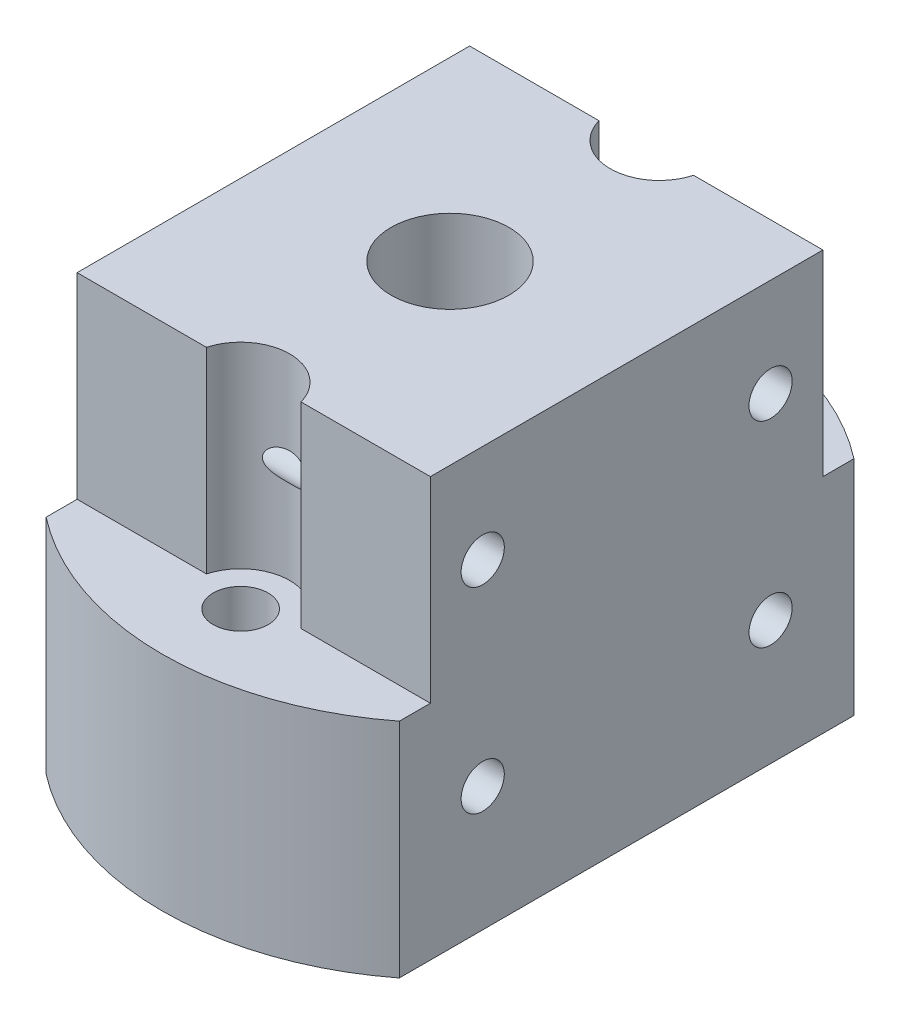
ISO-10303-21;
HEADER;
FILE_DESCRIPTION(('STEP AP214'),'2;1');
FILE_NAME('part.step','',(''),(''),'','','');
FILE_SCHEMA(('AUTOMOTIVE_DESIGN { 1 0 10303 214 1 1 1 1 }'));
ENDSEC;
DATA;
#1=APPLICATION_CONTEXT('core data for automotive mechanical design processes');
#2=APPLICATION_PROTOCOL_DEFINITION('international standard','automotive_design',2000,#1);
#3=PRODUCT_CONTEXT('',#1,'mechanical');
#4=PRODUCT('Part','Part','',(#3));
#5=PRODUCT_RELATED_PRODUCT_CATEGORY('part','',(#4));
#6=PRODUCT_DEFINITION_FORMATION('','',#4);
#7=PRODUCT_DEFINITION_CONTEXT('part definition',#1,'design');
#8=PRODUCT_DEFINITION('design','',#6,#7);
#9=PRODUCT_DEFINITION_SHAPE('','',#8);
#10=(LENGTH_UNIT() NAMED_UNIT(*) SI_UNIT(.MILLI.,.METRE.));
#11=(NAMED_UNIT(*) PLANE_ANGLE_UNIT() SI_UNIT($,.RADIAN.));
#12=(NAMED_UNIT(*) SI_UNIT($,.STERADIAN.) SOLID_ANGLE_UNIT());
#13=UNCERTAINTY_MEASURE_WITH_UNIT(LENGTH_MEASURE(1.E-05),#10,'distance_accuracy_value','');
#14=(GEOMETRIC_REPRESENTATION_CONTEXT(3) GLOBAL_UNCERTAINTY_ASSIGNED_CONTEXT((#13)) GLOBAL_UNIT_ASSIGNED_CONTEXT((#10,
#11,#12)) REPRESENTATION_CONTEXT('',''));
#15=CARTESIAN_POINT('',(0.,0.,0.));
#16=DIRECTION('',(0.,0.,1.));
#17=DIRECTION('',(1.,0.,0.));
#18=AXIS2_PLACEMENT_3D('',#15,#16,#17);
#19=CARTESIAN_POINT('',(-13.5,32.,15.));
#20=DIRECTION('',(0.,0.,-1.));
#21=DIRECTION('',(-1.,0.,0.));
#22=AXIS2_PLACEMENT_3D('',#19,#20,#21);
#23=PLANE('',#22);
#24=DIRECTION('',(1.,0.,0.));
#25=VECTOR('',#24,1.);
#26=CARTESIAN_POINT('',(-13.5,17.,15.));
#27=LINE('',#26,#25);
#28=CARTESIAN_POINT('',(-13.5,17.,15.));
#29=VERTEX_POINT('',#28);
#30=CARTESIAN_POINT('',(-3.61420807370023,17.,15.));
#31=VERTEX_POINT('',#30);
#32=EDGE_CURVE('E159',#29,#31,#27,.T.);
#33=ORIENTED_EDGE('',*,*,#32,.T.);
#34=DIRECTION('',(0.,1.,0.));
#35=VECTOR('',#34,1.);
#36=CARTESIAN_POINT('',(-3.61420807370023,6.39339828220178,15.));
#37=LINE('',#36,#35);
#38=CARTESIAN_POINT('',(-3.61420807370023,32.,15.));
#39=VERTEX_POINT('',#38);
#40=EDGE_CURVE('E11',#31,#39,#37,.T.);
#41=ORIENTED_EDGE('',*,*,#40,.T.);
#42=DIRECTION('',(1.,0.,0.));
#43=VECTOR('',#42,1.);
#44=CARTESIAN_POINT('',(-13.5,32.,15.));
#45=LINE('',#44,#43);
#46=CARTESIAN_POINT('',(-13.5,32.,15.));
#47=VERTEX_POINT('',#46);
#48=EDGE_CURVE('E177',#47,#39,#45,.T.);
#49=ORIENTED_EDGE('',*,*,#48,.F.);
#50=DIRECTION('',(0.,-1.,0.));
#51=VECTOR('',#50,1.);
#52=CARTESIAN_POINT('',(-13.5,32.,15.));
#53=LINE('',#52,#51);
#54=EDGE_CURVE('E176',#47,#29,#53,.T.);
#55=ORIENTED_EDGE('',*,*,#54,.T.);
#56=EDGE_LOOP('',(#33,#41,#49,#55));
#57=FACE_BOUND('',#56,.T.);
#58=ADVANCED_FACE('F41',(#57),#23,.F.);
#59=CARTESIAN_POINT('',(-13.5,32.,-15.));
#60=DIRECTION('',(0.,0.,1.));
#61=DIRECTION('',(1.,0.,0.));
#62=AXIS2_PLACEMENT_3D('',#59,#60,#61);
#63=PLANE('',#62);
#64=DIRECTION('',(-1.,0.,0.));
#65=VECTOR('',#64,1.);
#66=CARTESIAN_POINT('',(-13.5,17.,-15.));
#67=LINE('',#66,#65);
#68=CARTESIAN_POINT('',(13.5,17.,-15.));
#69=VERTEX_POINT('',#68);
#70=CARTESIAN_POINT('',(3.61420807370024,17.,-15.));
#71=VERTEX_POINT('',#70);
#72=EDGE_CURVE('E58',#69,#71,#67,.T.);
#73=ORIENTED_EDGE('',*,*,#72,.T.);
#74=DIRECTION('',(0.,1.,0.));
#75=VECTOR('',#74,1.);
#76=CARTESIAN_POINT('',(3.61420807370024,6.39339828220178,-15.));
#77=LINE('',#76,#75);
#78=CARTESIAN_POINT('',(3.61420807370024,32.,-15.));
#79=VERTEX_POINT('',#78);
#80=EDGE_CURVE('E139',#71,#79,#77,.T.);
#81=ORIENTED_EDGE('',*,*,#80,.T.);
#82=DIRECTION('',(-1.,0.,0.));
#83=VECTOR('',#82,1.);
#84=CARTESIAN_POINT('',(-13.5,32.,-15.));
#85=LINE('',#84,#83);
#86=CARTESIAN_POINT('',(13.5,32.,-15.));
#87=VERTEX_POINT('',#86);
#88=EDGE_CURVE('E292',#87,#79,#85,.T.);
#89=ORIENTED_EDGE('',*,*,#88,.F.);
#90=DIRECTION('',(0.,-1.,0.));
#91=VECTOR('',#90,1.);
#92=CARTESIAN_POINT('',(13.5,32.,-15.));
#93=LINE('',#92,#91);
#94=EDGE_CURVE('E181',#87,#69,#93,.T.);
#95=ORIENTED_EDGE('',*,*,#94,.T.);
#96=EDGE_LOOP('',(#73,#81,#89,#95));
#97=FACE_BOUND('',#96,.T.);
#98=ADVANCED_FACE('F267',(#97),#63,.F.);
#99=CARTESIAN_POINT('',(0.,17.,0.));
#100=DIRECTION('',(0.,1.,0.));
#101=DIRECTION('',(0.,0.,1.));
#102=AXIS2_PLACEMENT_3D('',#99,#100,#101);
#103=PLANE('',#102);
#104=CARTESIAN_POINT('',(3.61420807370025,17.,15.));
#105=VERTEX_POINT('',#104);
#106=CARTESIAN_POINT('',(13.5,17.,15.));
#107=VERTEX_POINT('',#106);
#108=EDGE_CURVE('E66',#105,#107,#27,.T.);
#109=ORIENTED_EDGE('',*,*,#108,.F.);
#110=CARTESIAN_POINT('',(0.,17.,16.));
#111=DIRECTION('',(0.,1.,0.));
#112=DIRECTION('',(0.,0.,1.));
#113=AXIS2_PLACEMENT_3D('',#110,#111,#112);
#114=CIRCLE('',#113,3.75);
#115=EDGE_CURVE('E299',#31,#105,#114,.F.);
#116=ORIENTED_EDGE('',*,*,#115,.F.);
#117=ORIENTED_EDGE('',*,*,#32,.F.);
#118=DIRECTION('',(0.,0.,1.));
#119=VECTOR('',#118,1.);
#120=CARTESIAN_POINT('',(-13.5,17.,17.3709527660402));
#121=LINE('',#120,#119);
#122=CARTESIAN_POINT('',(-13.5,17.,17.3709527660402));
#123=VERTEX_POINT('',#122);
#124=EDGE_CURVE('E204',#29,#123,#121,.T.);
#125=ORIENTED_EDGE('',*,*,#124,.T.);
#126=CARTESIAN_POINT('',(0.,17.,0.));
#127=DIRECTION('',(0.,1.,0.));
#128=DIRECTION('',(0.,0.,1.));
#129=AXIS2_PLACEMENT_3D('',#126,#127,#128);
#130=CIRCLE('',#129,22.);
#131=CARTESIAN_POINT('',(13.5,17.,17.3709527660402));
#132=VERTEX_POINT('',#131);
#133=EDGE_CURVE('E207',#123,#132,#130,.T.);
#134=ORIENTED_EDGE('',*,*,#133,.T.);
#135=DIRECTION('',(0.,0.,-1.));
#136=VECTOR('',#135,1.);
#137=CARTESIAN_POINT('',(13.5,17.,17.3709527660402));
#138=LINE('',#137,#136);
#139=EDGE_CURVE('E210',#132,#107,#138,.T.);
#140=ORIENTED_EDGE('',*,*,#139,.T.);
#141=EDGE_LOOP('',(#109,#116,#117,#125,#134,#140));
#142=FACE_BOUND('',#141,.T.);
#143=CARTESIAN_POINT('',(0.,17.,16.));
#144=DIRECTION('',(0.,1.,0.));
#145=DIRECTION('',(0.,0.,1.));
#146=AXIS2_PLACEMENT_3D('',#143,#144,#145);
#147=CIRCLE('',#146,2.1);
#148=CARTESIAN_POINT('',(0.,17.,18.1));
#149=VERTEX_POINT('',#148);
#150=EDGE_CURVE('E190',#149,#149,#147,.T.);
#151=ORIENTED_EDGE('',*,*,#150,.F.);
#152=EDGE_LOOP('',(#151));
#153=FACE_BOUND('',#152,.T.);
#154=ADVANCED_FACE('F274',(#142,#153),#103,.T.);
#155=CARTESIAN_POINT('',(-3.61420807370024,17.,-15.));
#156=VERTEX_POINT('',#155);
#157=CARTESIAN_POINT('',(-13.5,17.,-15.));
#158=VERTEX_POINT('',#157);
#159=EDGE_CURVE('E147',#156,#158,#67,.T.);
#160=ORIENTED_EDGE('',*,*,#159,.F.);
#161=CARTESIAN_POINT('',(0.,17.,-16.));
#162=DIRECTION('',(0.,1.,0.));
#163=DIRECTION('',(0.,0.,1.));
#164=AXIS2_PLACEMENT_3D('',#161,#162,#163);
#165=CIRCLE('',#164,3.75);
#166=EDGE_CURVE('E133',#71,#156,#165,.F.);
#167=ORIENTED_EDGE('',*,*,#166,.F.);
#168=ORIENTED_EDGE('',*,*,#72,.F.);
#169=CARTESIAN_POINT('',(13.5,17.,-17.3709527660402));
#170=VERTEX_POINT('',#169);
#171=EDGE_CURVE('E209',#69,#170,#138,.T.);
#172=ORIENTED_EDGE('',*,*,#171,.T.);
#173=CARTESIAN_POINT('',(0.,17.,0.));
#174=DIRECTION('',(0.,1.,0.));
#175=DIRECTION('',(0.,0.,1.));
#176=AXIS2_PLACEMENT_3D('',#173,#174,#175);
#177=CIRCLE('',#176,22.);
#178=CARTESIAN_POINT('',(-13.5,17.,-17.3709527660402));
#179=VERTEX_POINT('',#178);
#180=EDGE_CURVE('E202',#170,#179,#177,.T.);
#181=ORIENTED_EDGE('',*,*,#180,.T.);
#182=EDGE_CURVE('E154',#179,#158,#121,.T.);
#183=ORIENTED_EDGE('',*,*,#182,.T.);
#184=EDGE_LOOP('',(#160,#167,#168,#172,#181,#183));
#185=FACE_BOUND('',#184,.T.);
#186=CARTESIAN_POINT('',(0.,17.,-16.));
#187=DIRECTION('',(0.,1.,0.));
#188=DIRECTION('',(0.,0.,1.));
#189=AXIS2_PLACEMENT_3D('',#186,#187,#188);
#190=CIRCLE('',#189,2.1);
#191=CARTESIAN_POINT('',(0.,17.,-13.9));
#192=VERTEX_POINT('',#191);
#193=EDGE_CURVE('E196',#192,#192,#190,.T.);
#194=ORIENTED_EDGE('',*,*,#193,.F.);
#195=EDGE_LOOP('',(#194));
#196=FACE_BOUND('',#195,.T.);
#197=ADVANCED_FACE('F151',(#185,#196),#103,.T.);
#198=CARTESIAN_POINT('',(0.,0.,0.));
#199=DIRECTION('',(0.,1.,0.));
#200=DIRECTION('',(0.,0.,1.));
#201=AXIS2_PLACEMENT_3D('',#198,#199,#200);
#202=PLANE('',#201);
#203=CARTESIAN_POINT('',(0.,0.,0.));
#204=DIRECTION('',(0.,1.,0.));
#205=DIRECTION('',(0.,0.,1.));
#206=AXIS2_PLACEMENT_3D('',#203,#204,#205);
#207=CIRCLE('',#206,22.);
#208=CARTESIAN_POINT('',(13.5,0.,-17.3709527660402));
#209=VERTEX_POINT('',#208);
#210=CARTESIAN_POINT('',(-13.5,0.,-17.3709527660402));
#211=VERTEX_POINT('',#210);
#212=EDGE_CURVE('E199',#209,#211,#207,.T.);
#213=ORIENTED_EDGE('',*,*,#212,.F.);
#214=DIRECTION('',(0.,0.,-1.));
#215=VECTOR('',#214,1.);
#216=CARTESIAN_POINT('',(13.5,0.,17.3709527660402));
#217=LINE('',#216,#215);
#218=CARTESIAN_POINT('',(13.5,0.,17.3709527660402));
#219=VERTEX_POINT('',#218);
#220=EDGE_CURVE('E205',#219,#209,#217,.T.);
#221=ORIENTED_EDGE('',*,*,#220,.F.);
#222=CARTESIAN_POINT('',(0.,0.,0.));
#223=DIRECTION('',(0.,1.,0.));
#224=DIRECTION('',(0.,0.,1.));
#225=AXIS2_PLACEMENT_3D('',#222,#223,#224);
#226=CIRCLE('',#225,22.);
#227=CARTESIAN_POINT('',(-13.5,0.,17.3709527660402));
#228=VERTEX_POINT('',#227);
#229=EDGE_CURVE('E217',#228,#219,#226,.T.);
#230=ORIENTED_EDGE('',*,*,#229,.F.);
#231=DIRECTION('',(0.,0.,1.));
#232=VECTOR('',#231,1.);
#233=CARTESIAN_POINT('',(-13.5,0.,17.3709527660402));
#234=LINE('',#233,#232);
#235=EDGE_CURVE('E215',#211,#228,#234,.T.);
#236=ORIENTED_EDGE('',*,*,#235,.F.);
#237=EDGE_LOOP('',(#213,#221,#230,#236));
#238=FACE_BOUND('',#237,.T.);
#239=CARTESIAN_POINT('',(0.,0.,-16.));
#240=DIRECTION('',(0.,1.,0.));
#241=DIRECTION('',(0.,0.,1.));
#242=AXIS2_PLACEMENT_3D('',#239,#240,#241);
#243=CIRCLE('',#242,2.1);
#244=CARTESIAN_POINT('',(0.,0.,-13.9));
#245=VERTEX_POINT('',#244);
#246=EDGE_CURVE('E193',#245,#245,#243,.T.);
#247=ORIENTED_EDGE('',*,*,#246,.T.);
#248=EDGE_LOOP('',(#247));
#249=FACE_BOUND('',#248,.T.);
#250=CARTESIAN_POINT('',(0.,0.,16.));
#251=DIRECTION('',(0.,1.,0.));
#252=DIRECTION('',(0.,0.,1.));
#253=AXIS2_PLACEMENT_3D('',#250,#251,#252);
#254=CIRCLE('',#253,2.1);
#255=CARTESIAN_POINT('',(0.,0.,18.1));
#256=VERTEX_POINT('',#255);
#257=EDGE_CURVE('E189',#256,#256,#254,.T.);
#258=ORIENTED_EDGE('',*,*,#257,.T.);
#259=EDGE_LOOP('',(#258));
#260=FACE_BOUND('',#259,.T.);
#261=CARTESIAN_POINT('',(0.,0.,0.));
#262=DIRECTION('',(0.,1.,0.));
#263=DIRECTION('',(0.,0.,1.));
#264=AXIS2_PLACEMENT_3D('',#261,#262,#263);
#265=CIRCLE('',#264,8.15);
#266=CARTESIAN_POINT('',(0.,0.,8.15));
#267=VERTEX_POINT('',#266);
#268=EDGE_CURVE('E186',#267,#267,#265,.T.);
#269=ORIENTED_EDGE('',*,*,#268,.T.);
#270=EDGE_LOOP('',(#269));
#271=FACE_BOUND('',#270,.T.);
#272=ADVANCED_FACE('F341',(#238,#249,#260,#271),#202,.F.);
#273=CARTESIAN_POINT('',(0.,17.,0.));
#274=DIRECTION('',(0.,-1.,0.));
#275=DIRECTION('',(0.,0.,-1.));
#276=AXIS2_PLACEMENT_3D('',#273,#274,#275);
#277=CYLINDRICAL_SURFACE('',#276,22.);
#278=ORIENTED_EDGE('',*,*,#212,.T.);
#279=DIRECTION('',(0.,-1.,0.));
#280=VECTOR('',#279,1.);
#281=CARTESIAN_POINT('',(-13.5,17.,-17.3709527660402));
#282=LINE('',#281,#280);
#283=EDGE_CURVE('E156',#179,#211,#282,.T.);
#284=ORIENTED_EDGE('',*,*,#283,.F.);
#285=ORIENTED_EDGE('',*,*,#180,.F.);
#286=DIRECTION('',(0.,-1.,0.));
#287=VECTOR('',#286,1.);
#288=CARTESIAN_POINT('',(13.5,17.,-17.3709527660402));
#289=LINE('',#288,#287);
#290=EDGE_CURVE('E212',#170,#209,#289,.T.);
#291=ORIENTED_EDGE('',*,*,#290,.T.);
#292=EDGE_LOOP('',(#278,#284,#285,#291));
#293=FACE_BOUND('',#292,.T.);
#294=ADVANCED_FACE('F43',(#293),#277,.T.);
#295=CARTESIAN_POINT('',(-13.5,17.,17.3709527660402));
#296=DIRECTION('',(1.,0.,0.));
#297=DIRECTION('',(0.,0.,-1.));
#298=AXIS2_PLACEMENT_3D('',#295,#296,#297);
#299=PLANE('',#298);
#300=CARTESIAN_POINT('',(-13.5,24.5,-11.));
#301=DIRECTION('',(-1.,0.,0.));
#302=DIRECTION('',(0.,0.,-1.));
#303=AXIS2_PLACEMENT_3D('',#300,#301,#302);
#304=CIRCLE('',#303,1.65);
#305=CARTESIAN_POINT('',(-13.5,24.5,-12.65));
#306=VERTEX_POINT('',#305);
#307=EDGE_CURVE('E305',#306,#306,#304,.T.);
#308=ORIENTED_EDGE('',*,*,#307,.F.);
#309=EDGE_LOOP('',(#308));
#310=FACE_BOUND('',#309,.T.);
#311=CARTESIAN_POINT('',(-13.5,9.50000000000001,11.));
#312=DIRECTION('',(-1.,0.,0.));
#313=DIRECTION('',(0.,0.,1.));
#314=AXIS2_PLACEMENT_3D('',#311,#312,#313);
#315=CIRCLE('',#314,1.65);
#316=CARTESIAN_POINT('',(-13.5,9.50000000000001,12.65));
#317=VERTEX_POINT('',#316);
#318=EDGE_CURVE('E311',#317,#317,#315,.T.);
#319=ORIENTED_EDGE('',*,*,#318,.F.);
#320=EDGE_LOOP('',(#319));
#321=FACE_BOUND('',#320,.T.);
#322=CARTESIAN_POINT('',(-13.5,9.50000000000001,-11.));
#323=DIRECTION('',(-1.,0.,0.));
#324=DIRECTION('',(0.,0.,-1.));
#325=AXIS2_PLACEMENT_3D('',#322,#323,#324);
#326=CIRCLE('',#325,1.65);
#327=CARTESIAN_POINT('',(-13.5,9.50000000000001,-12.65));
#328=VERTEX_POINT('',#327);
#329=EDGE_CURVE('E312',#328,#328,#326,.T.);
#330=ORIENTED_EDGE('',*,*,#329,.F.);
#331=EDGE_LOOP('',(#330));
#332=FACE_BOUND('',#331,.T.);
#333=CARTESIAN_POINT('',(-13.5,24.5,11.));
#334=DIRECTION('',(-1.,0.,0.));
#335=DIRECTION('',(0.,0.,1.));
#336=AXIS2_PLACEMENT_3D('',#333,#334,#335);
#337=CIRCLE('',#336,1.65);
#338=CARTESIAN_POINT('',(-13.5,24.5,12.65));
#339=VERTEX_POINT('',#338);
#340=EDGE_CURVE('E302',#339,#339,#337,.T.);
#341=ORIENTED_EDGE('',*,*,#340,.F.);
#342=EDGE_LOOP('',(#341));
#343=FACE_BOUND('',#342,.T.);
#344=ORIENTED_EDGE('',*,*,#235,.T.);
#345=DIRECTION('',(0.,-1.,0.));
#346=VECTOR('',#345,1.);
#347=CARTESIAN_POINT('',(-13.5,17.,17.3709527660402));
#348=LINE('',#347,#346);
#349=EDGE_CURVE('E161',#123,#228,#348,.T.);
#350=ORIENTED_EDGE('',*,*,#349,.F.);
#351=ORIENTED_EDGE('',*,*,#124,.F.);
#352=ORIENTED_EDGE('',*,*,#54,.F.);
#353=DIRECTION('',(0.,0.,1.));
#354=VECTOR('',#353,1.);
#355=CARTESIAN_POINT('',(-13.5,32.,15.));
#356=LINE('',#355,#354);
#357=CARTESIAN_POINT('',(-13.5,32.,-15.));
#358=VERTEX_POINT('',#357);
#359=EDGE_CURVE('E290',#358,#47,#356,.T.);
#360=ORIENTED_EDGE('',*,*,#359,.F.);
#361=DIRECTION('',(0.,-1.,0.));
#362=VECTOR('',#361,1.);
#363=CARTESIAN_POINT('',(-13.5,32.,-15.));
#364=LINE('',#363,#362);
#365=EDGE_CURVE('E179',#358,#158,#364,.T.);
#366=ORIENTED_EDGE('',*,*,#365,.T.);
#367=ORIENTED_EDGE('',*,*,#182,.F.);
#368=ORIENTED_EDGE('',*,*,#283,.T.);
#369=EDGE_LOOP('',(#344,#350,#351,#352,#360,#366,#367,#368));
#370=FACE_BOUND('',#369,.T.);
#371=ADVANCED_FACE('F348',(#310,#321,#332,#343,#370),#299,.F.);
#372=CARTESIAN_POINT('',(0.,17.,0.));
#373=DIRECTION('',(0.,-1.,0.));
#374=DIRECTION('',(0.,0.,-1.));
#375=AXIS2_PLACEMENT_3D('',#372,#373,#374);
#376=CYLINDRICAL_SURFACE('',#375,22.);
#377=ORIENTED_EDGE('',*,*,#229,.T.);
#378=DIRECTION('',(0.,-1.,0.));
#379=VECTOR('',#378,1.);
#380=CARTESIAN_POINT('',(13.5,17.,17.3709527660402));
#381=LINE('',#380,#379);
#382=EDGE_CURVE('E222',#132,#219,#381,.T.);
#383=ORIENTED_EDGE('',*,*,#382,.F.);
#384=ORIENTED_EDGE('',*,*,#133,.F.);
#385=ORIENTED_EDGE('',*,*,#349,.T.);
#386=EDGE_LOOP('',(#377,#383,#384,#385));
#387=FACE_BOUND('',#386,.T.);
#388=ADVANCED_FACE('F359',(#387),#376,.T.);
#389=CARTESIAN_POINT('',(13.5,17.,17.3709527660402));
#390=DIRECTION('',(-1.,0.,0.));
#391=DIRECTION('',(0.,0.,1.));
#392=AXIS2_PLACEMENT_3D('',#389,#390,#391);
#393=PLANE('',#392);
#394=CARTESIAN_POINT('',(13.5,24.5,-11.));
#395=DIRECTION('',(-1.,0.,0.));
#396=DIRECTION('',(0.,0.,-1.));
#397=AXIS2_PLACEMENT_3D('',#394,#395,#396);
#398=CIRCLE('',#397,1.65);
#399=CARTESIAN_POINT('',(13.5,24.5,-12.65));
#400=VERTEX_POINT('',#399);
#401=EDGE_CURVE('E315',#400,#400,#398,.T.);
#402=ORIENTED_EDGE('',*,*,#401,.T.);
#403=EDGE_LOOP('',(#402));
#404=FACE_BOUND('',#403,.T.);
#405=CARTESIAN_POINT('',(13.5,9.50000000000001,11.));
#406=DIRECTION('',(-1.,0.,0.));
#407=DIRECTION('',(0.,0.,1.));
#408=AXIS2_PLACEMENT_3D('',#405,#406,#407);
#409=CIRCLE('',#408,1.65);
#410=CARTESIAN_POINT('',(13.5,9.50000000000001,12.65));
#411=VERTEX_POINT('',#410);
#412=EDGE_CURVE('E308',#411,#411,#409,.T.);
#413=ORIENTED_EDGE('',*,*,#412,.T.);
#414=EDGE_LOOP('',(#413));
#415=FACE_BOUND('',#414,.T.);
#416=CARTESIAN_POINT('',(13.5,9.50000000000001,-11.));
#417=DIRECTION('',(-1.,0.,0.));
#418=DIRECTION('',(0.,0.,-1.));
#419=AXIS2_PLACEMENT_3D('',#416,#417,#418);
#420=CIRCLE('',#419,1.65);
#421=CARTESIAN_POINT('',(13.5,9.50000000000001,-12.65));
#422=VERTEX_POINT('',#421);
#423=EDGE_CURVE('E320',#422,#422,#420,.T.);
#424=ORIENTED_EDGE('',*,*,#423,.T.);
#425=EDGE_LOOP('',(#424));
#426=FACE_BOUND('',#425,.T.);
#427=CARTESIAN_POINT('',(13.5,24.5,11.));
#428=DIRECTION('',(-1.,0.,0.));
#429=DIRECTION('',(0.,0.,1.));
#430=AXIS2_PLACEMENT_3D('',#427,#428,#429);
#431=CIRCLE('',#430,1.65);
#432=CARTESIAN_POINT('',(13.5,24.5,12.65));
#433=VERTEX_POINT('',#432);
#434=EDGE_CURVE('E237',#433,#433,#431,.T.);
#435=ORIENTED_EDGE('',*,*,#434,.T.);
#436=EDGE_LOOP('',(#435));
#437=FACE_BOUND('',#436,.T.);
#438=ORIENTED_EDGE('',*,*,#220,.T.);
#439=ORIENTED_EDGE('',*,*,#290,.F.);
#440=ORIENTED_EDGE('',*,*,#171,.F.);
#441=ORIENTED_EDGE('',*,*,#94,.F.);
#442=DIRECTION('',(0.,0.,-1.));
#443=VECTOR('',#442,1.);
#444=CARTESIAN_POINT('',(13.5,32.,15.));
#445=LINE('',#444,#443);
#446=CARTESIAN_POINT('',(13.5,32.,15.));
#447=VERTEX_POINT('',#446);
#448=EDGE_CURVE('E167',#447,#87,#445,.T.);
#449=ORIENTED_EDGE('',*,*,#448,.F.);
#450=DIRECTION('',(0.,-1.,0.));
#451=VECTOR('',#450,1.);
#452=CARTESIAN_POINT('',(13.5,32.,15.));
#453=LINE('',#452,#451);
#454=EDGE_CURVE('E173',#447,#107,#453,.T.);
#455=ORIENTED_EDGE('',*,*,#454,.T.);
#456=ORIENTED_EDGE('',*,*,#139,.F.);
#457=ORIENTED_EDGE('',*,*,#382,.T.);
#458=EDGE_LOOP('',(#438,#439,#440,#441,#449,#455,#456,#457));
#459=FACE_BOUND('',#458,.T.);
#460=ADVANCED_FACE('F356',(#404,#415,#426,#437,#459),#393,.F.);
#461=CARTESIAN_POINT('',(0.,17.,-16.));
#462=DIRECTION('',(0.,-1.,0.));
#463=DIRECTION('',(0.,0.,-1.));
#464=AXIS2_PLACEMENT_3D('',#461,#462,#463);
#465=CYLINDRICAL_SURFACE('',#464,2.1);
#466=ORIENTED_EDGE('',*,*,#193,.T.);
#467=EDGE_LOOP('',(#466));
#468=FACE_BOUND('',#467,.T.);
#469=ORIENTED_EDGE('',*,*,#246,.F.);
#470=EDGE_LOOP('',(#469));
#471=FACE_BOUND('',#470,.T.);
#472=ADVANCED_FACE('F358',(#468,#471),#465,.F.);
#473=CARTESIAN_POINT('',(0.,17.,16.));
#474=DIRECTION('',(0.,-1.,0.));
#475=DIRECTION('',(0.,0.,-1.));
#476=AXIS2_PLACEMENT_3D('',#473,#474,#475);
#477=CYLINDRICAL_SURFACE('',#476,2.1);
#478=ORIENTED_EDGE('',*,*,#150,.T.);
#479=EDGE_LOOP('',(#478));
#480=FACE_BOUND('',#479,.T.);
#481=ORIENTED_EDGE('',*,*,#257,.F.);
#482=EDGE_LOOP('',(#481));
#483=FACE_BOUND('',#482,.T.);
#484=ADVANCED_FACE('F337',(#480,#483),#477,.F.);
#485=CARTESIAN_POINT('',(0.,17.,0.));
#486=DIRECTION('',(0.,-1.,0.));
#487=DIRECTION('',(0.,0.,-1.));
#488=AXIS2_PLACEMENT_3D('',#485,#486,#487);
#489=CYLINDRICAL_SURFACE('',#488,8.15);
#490=CARTESIAN_POINT('',(0.,17.,0.));
#491=DIRECTION('',(0.,1.,0.));
#492=DIRECTION('',(0.,0.,1.));
#493=AXIS2_PLACEMENT_3D('',#490,#491,#492);
#494=CIRCLE('',#493,8.15);
#495=CARTESIAN_POINT('',(0.,17.,8.15));
#496=VERTEX_POINT('',#495);
#497=EDGE_CURVE('E183',#496,#496,#494,.T.);
#498=ORIENTED_EDGE('',*,*,#497,.T.);
#499=EDGE_LOOP('',(#498));
#500=FACE_BOUND('',#499,.T.);
#501=ORIENTED_EDGE('',*,*,#268,.F.);
#502=EDGE_LOOP('',(#501));
#503=FACE_BOUND('',#502,.T.);
#504=ADVANCED_FACE('F283',(#500,#503),#489,.F.);
#505=CARTESIAN_POINT('',(0.,32.,0.));
#506=DIRECTION('',(0.,-1.,0.));
#507=DIRECTION('',(0.,0.,-1.));
#508=AXIS2_PLACEMENT_3D('',#505,#506,#507);
#509=PLANE('',#508);
#510=CARTESIAN_POINT('',(0.,32.,0.));
#511=DIRECTION('',(0.,1.,0.));
#512=DIRECTION('',(0.,0.,1.));
#513=AXIS2_PLACEMENT_3D('',#510,#511,#512);
#514=CIRCLE('',#513,4.5);
#515=CARTESIAN_POINT('',(0.,32.,4.5));
#516=VERTEX_POINT('',#515);
#517=EDGE_CURVE('E325',#516,#516,#514,.T.);
#518=ORIENTED_EDGE('',*,*,#517,.F.);
#519=EDGE_LOOP('',(#518));
#520=FACE_BOUND('',#519,.T.);
#521=ORIENTED_EDGE('',*,*,#88,.T.);
#522=CARTESIAN_POINT('',(0.,32.,-16.));
#523=DIRECTION('',(0.,1.,0.));
#524=DIRECTION('',(0.,0.,1.));
#525=AXIS2_PLACEMENT_3D('',#522,#523,#524);
#526=CIRCLE('',#525,3.75);
#527=CARTESIAN_POINT('',(-3.61420807370024,32.,-15.));
#528=VERTEX_POINT('',#527);
#529=EDGE_CURVE('E141',#528,#79,#526,.T.);
#530=ORIENTED_EDGE('',*,*,#529,.F.);
#531=EDGE_CURVE('E149',#528,#358,#85,.T.);
#532=ORIENTED_EDGE('',*,*,#531,.T.);
#533=ORIENTED_EDGE('',*,*,#359,.T.);
#534=ORIENTED_EDGE('',*,*,#48,.T.);
#535=CARTESIAN_POINT('',(0.,32.,16.));
#536=DIRECTION('',(0.,1.,0.));
#537=DIRECTION('',(0.,0.,1.));
#538=AXIS2_PLACEMENT_3D('',#535,#536,#537);
#539=CIRCLE('',#538,3.75);
#540=CARTESIAN_POINT('',(3.61420807370025,32.,15.));
#541=VERTEX_POINT('',#540);
#542=EDGE_CURVE('E297',#541,#39,#539,.T.);
#543=ORIENTED_EDGE('',*,*,#542,.F.);
#544=EDGE_CURVE('E286',#541,#447,#45,.T.);
#545=ORIENTED_EDGE('',*,*,#544,.T.);
#546=ORIENTED_EDGE('',*,*,#448,.T.);
#547=EDGE_LOOP('',(#521,#530,#532,#533,#534,#543,#545,#546));
#548=FACE_BOUND('',#547,.T.);
#549=ADVANCED_FACE('F277',(#520,#548),#509,.F.);
#550=ORIENTED_EDGE('',*,*,#544,.F.);
#551=DIRECTION('',(0.,1.,0.));
#552=VECTOR('',#551,1.);
#553=CARTESIAN_POINT('',(3.61420807370025,6.39339828220178,15.));
#554=LINE('',#553,#552);
#555=EDGE_CURVE('E50',#541,#105,#554,.F.);
#556=ORIENTED_EDGE('',*,*,#555,.T.);
#557=ORIENTED_EDGE('',*,*,#108,.T.);
#558=ORIENTED_EDGE('',*,*,#454,.F.);
#559=EDGE_LOOP('',(#550,#556,#557,#558));
#560=FACE_BOUND('',#559,.T.);
#561=ADVANCED_FACE('F269',(#560),#23,.F.);
#562=ORIENTED_EDGE('',*,*,#531,.F.);
#563=DIRECTION('',(0.,1.,0.));
#564=VECTOR('',#563,1.);
#565=CARTESIAN_POINT('',(-3.61420807370024,6.39339828220178,-15.));
#566=LINE('',#565,#564);
#567=EDGE_CURVE('E136',#528,#156,#566,.F.);
#568=ORIENTED_EDGE('',*,*,#567,.T.);
#569=ORIENTED_EDGE('',*,*,#159,.T.);
#570=ORIENTED_EDGE('',*,*,#365,.F.);
#571=EDGE_LOOP('',(#562,#568,#569,#570));
#572=FACE_BOUND('',#571,.T.);
#573=ADVANCED_FACE('F145',(#572),#63,.F.);
#574=CARTESIAN_POINT('',(0.,17.,0.));
#575=DIRECTION('',(0.,-1.,0.));
#576=DIRECTION('',(0.,0.,-1.));
#577=AXIS2_PLACEMENT_3D('',#574,#575,#576);
#578=PLANE('',#577);
#579=CARTESIAN_POINT('',(0.,17.,0.));
#580=DIRECTION('',(0.,-1.,0.));
#581=DIRECTION('',(0.,0.,-1.));
#582=AXIS2_PLACEMENT_3D('',#579,#580,#581);
#583=CIRCLE('',#582,4.5);
#584=CARTESIAN_POINT('',(0.,17.,-4.5));
#585=VERTEX_POINT('',#584);
#586=EDGE_CURVE('E45',#585,#585,#583,.T.);
#587=ORIENTED_EDGE('',*,*,#586,.F.);
#588=EDGE_LOOP('',(#587));
#589=FACE_BOUND('',#588,.T.);
#590=ORIENTED_EDGE('',*,*,#497,.F.);
#591=EDGE_LOOP('',(#590));
#592=FACE_BOUND('',#591,.T.);
#593=ADVANCED_FACE('F255',(#589,#592),#578,.T.);
#594=CARTESIAN_POINT('',(0.,6.39339828220178,-16.));
#595=DIRECTION('',(0.,1.,0.));
#596=DIRECTION('',(0.,0.,1.));
#597=AXIS2_PLACEMENT_3D('',#594,#595,#596);
#598=CYLINDRICAL_SURFACE('',#597,3.75);
#599=CARTESIAN_POINT('',(0.,23.4229670385731,-12.25));
#600=CARTESIAN_POINT('',(0.0701775396761115,23.4229659968329,-12.250000590597));
#601=CARTESIAN_POINT('',(0.140372907142057,23.4252448718409,-12.2519739821138));
#602=CARTESIAN_POINT('',(0.280284778836514,23.4344677972763,-12.2598321690958));
#603=CARTESIAN_POINT('',(0.350000877077803,23.4414154039089,-12.2657199461393));
#604=CARTESIAN_POINT('',(0.488408850994143,23.4603131164693,-12.28128943758));
#605=CARTESIAN_POINT('',(0.557099636939948,23.4722681998988,-12.2909749263421));
#606=CARTESIAN_POINT('',(0.692632863191936,23.5017184444019,-12.3138801338331));
#607=CARTESIAN_POINT('',(0.759476775916002,23.5192090450844,-12.3270969419218));
#608=CARTESIAN_POINT('',(0.901753439194585,23.5640488268766,-12.3591869556488));
#609=CARTESIAN_POINT('',(0.976694680526696,23.592573903061,-12.37864137697));
#610=CARTESIAN_POINT('',(1.12084382705065,23.6598513703988,-12.420641134821));
#611=CARTESIAN_POINT('',(1.1900646062901,23.6985799266733,-12.4431792098489));
#612=CARTESIAN_POINT('',(1.30362859975568,23.7767300689832,-12.4835059118636));
#613=CARTESIAN_POINT('',(1.34984924564792,23.8135258520939,-12.501062840962));
#614=CARTESIAN_POINT('',(1.43581758035415,23.8943637774009,-12.5354566815214));
#615=CARTESIAN_POINT('',(1.47557358673328,23.9383964592953,-12.5522944972994));
#616=CARTESIAN_POINT('',(1.53891529391292,24.0234672691253,-12.5801789560089));
#617=CARTESIAN_POINT('',(1.56414051978958,24.0631250046495,-12.5916933839493));
#618=CARTESIAN_POINT('',(1.60818197947756,24.1464703787741,-12.6122511454308));
#619=CARTESIAN_POINT('',(1.62700163026926,24.1901558529671,-12.6212957959354));
#620=CARTESIAN_POINT('',(1.65728506991482,24.280944559837,-12.6360444201119));
#621=CARTESIAN_POINT('',(1.66869388604889,24.3280705131917,-12.6417234010516));
#622=CARTESIAN_POINT('',(1.68314640249248,24.4238987998244,-12.6489423044786));
#623=CARTESIAN_POINT('',(1.68619515936612,24.4726001621736,-12.6504847289407));
#624=CARTESIAN_POINT('',(1.68387383823994,24.5638770934288,-12.6493185486484));
#625=CARTESIAN_POINT('',(1.67946884169884,24.6064873803142,-12.6470972119827));
#626=CARTESIAN_POINT('',(1.66428303266582,24.6902561286683,-12.6395337819196));
#627=CARTESIAN_POINT('',(1.65350256675409,24.7314146689273,-12.6341918581624));
#628=CARTESIAN_POINT('',(1.6261158841757,24.8112914831971,-12.6208765029831));
#629=CARTESIAN_POINT('',(1.60950668389643,24.8500084954422,-12.6129017239791));
#630=CARTESIAN_POINT('',(1.57120607115058,24.924321714135,-12.5949655939019));
#631=CARTESIAN_POINT('',(1.54951248507752,24.9599165768756,-12.5850033934655));
#632=CARTESIAN_POINT('',(1.49125109808351,25.0426401713538,-12.559058858567));
#633=CARTESIAN_POINT('',(1.45234888436069,25.0879043866027,-12.5423630738351));
#634=CARTESIAN_POINT('',(1.36773658098679,25.1711182324273,-12.5080241293338));
#635=CARTESIAN_POINT('',(1.32201196030289,25.2090518438063,-12.4903790001386));
#636=CARTESIAN_POINT('',(1.2051756646578,25.2926376930454,-12.4481926548985));
#637=CARTESIAN_POINT('',(1.13149225958534,25.334794060981,-12.4238828685827));
#638=CARTESIAN_POINT('',(0.977583835474668,25.4073695255122,-12.37877052493));
#639=CARTESIAN_POINT('',(0.89734673565915,25.4377663254365,-12.3579746717907));
#640=CARTESIAN_POINT('',(0.757078884430285,25.4812000347303,-12.3267345050196));
#641=CARTESIAN_POINT('',(0.698061817526095,25.4967129986705,-12.3150456767962));
#642=CARTESIAN_POINT('',(0.57855849913644,25.523379740808,-12.2944035612425));
#643=CARTESIAN_POINT('',(0.518071676474352,25.5345317945318,-12.2854513563843));
#644=CARTESIAN_POINT('',(0.396109412291125,25.5528719458469,-12.2704722776808));
#645=CARTESIAN_POINT('',(0.334633326032242,25.5600573408331,-12.2644473986458));
#646=CARTESIAN_POINT('',(0.211112142029434,25.5707156545789,-12.2554348292119));
#647=CARTESIAN_POINT('',(0.149066782074528,25.574186765977,-12.252448617456));
#648=CARTESIAN_POINT('',(0.0234843732375003,25.5775731422437,-12.2495364555083));
#649=CARTESIAN_POINT('',(-0.0400563025841309,25.5774111034686,-12.2496770344973));
#650=CARTESIAN_POINT('',(-0.16690051474682,25.5733357631008,-12.253178917518));
#651=CARTESIAN_POINT('',(-0.23020414365381,25.5694241229953,-12.2565387950448));
#652=CARTESIAN_POINT('',(-0.356173060333006,25.5577064601666,-12.2664188900973));
#653=CARTESIAN_POINT('',(-0.418838682036831,25.5499025942075,-12.2729373573251));
#654=CARTESIAN_POINT('',(-0.543088221591849,25.5301093489704,-12.2890053270684));
#655=CARTESIAN_POINT('',(-0.604672485266811,25.5181213343878,-12.2985538412165));
#656=CARTESIAN_POINT('',(-0.75440888430679,25.4829054748926,-12.3255597159443));
#657=CARTESIAN_POINT('',(-0.841680036175371,25.457043542993,-12.344632571777));
#658=CARTESIAN_POINT('',(-1.01052475646135,25.3934940627695,-12.3876760787346));
#659=CARTESIAN_POINT('',(-1.0921077928162,25.3558267683144,-12.4116383170035));
#660=CARTESIAN_POINT('',(-1.22360263766643,25.2793797754959,-12.4547770504746));
#661=CARTESIAN_POINT('',(-1.27578894993835,25.244161641452,-12.4732978634778));
#662=CARTESIAN_POINT('',(-1.37384809006939,25.1657822131493,-12.5103338730999));
#663=CARTESIAN_POINT('',(-1.41973061223966,25.1226333596304,-12.528849033643));
#664=CARTESIAN_POINT('',(-1.49355349474863,25.0386741472695,-12.5600821588732));
#665=CARTESIAN_POINT('',(-1.52320881026337,24.9995171468602,-12.5731678875024));
#666=CARTESIAN_POINT('',(-1.57609644148196,24.9164348575255,-12.5971683611343));
#667=CARTESIAN_POINT('',(-1.59933141939814,24.8725115555152,-12.6080840054407));
#668=CARTESIAN_POINT('',(-1.63825576081976,24.7802641209855,-12.6267087249302));
#669=CARTESIAN_POINT('',(-1.65387467924751,24.731903643343,-12.6343877779897));
#670=CARTESIAN_POINT('',(-1.67612378117385,24.6326821680991,-12.6454105702995));
#671=CARTESIAN_POINT('',(-1.68276274214263,24.5818236626755,-12.6487585428299));
#672=CARTESIAN_POINT('',(-1.68628045241751,24.4871376461766,-12.6505288402065));
#673=CARTESIAN_POINT('',(-1.68443970813541,24.4433647504432,-12.649597445907));
#674=CARTESIAN_POINT('',(-1.67396151790957,24.3568593698764,-12.644349972996));
#675=CARTESIAN_POINT('',(-1.66532515243458,24.3141267207625,-12.6400344324467));
#676=CARTESIAN_POINT('',(-1.64211982675385,24.2322211982325,-12.6286352283823));
#677=CARTESIAN_POINT('',(-1.62774917453418,24.1929782185421,-12.6216443861561));
#678=CARTESIAN_POINT('',(-1.59376513476857,24.1173342424923,-12.6054798910756));
#679=CARTESIAN_POINT('',(-1.57414980348364,24.0809343062737,-12.5963054290853));
#680=CARTESIAN_POINT('',(-1.52183481158032,23.9977872689491,-12.5725188021036));
#681=CARTESIAN_POINT('',(-1.48702001945027,23.9525754975269,-12.5571846548066));
#682=CARTESIAN_POINT('',(-1.41062046096286,23.8688539336711,-12.5251799338137));
#683=CARTESIAN_POINT('',(-1.36902302343314,23.8303569697717,-12.5085068889925));
#684=CARTESIAN_POINT('',(-1.26289321411882,23.7455364565736,-12.4684337249838));
#685=CARTESIAN_POINT('',(-1.19588214438629,23.7023291563508,-12.4450356891045));
#686=CARTESIAN_POINT('',(-1.0551570193486,23.6268866209549,-12.4007471744735));
#687=CARTESIAN_POINT('',(-0.981427122251641,23.5946782140251,-12.3798629063842));
#688=CARTESIAN_POINT('',(-0.851103202664379,23.5473699700266,-12.347427296694));
#689=CARTESIAN_POINT('',(-0.795543820229718,23.5300070165111,-12.3349052368503));
#690=CARTESIAN_POINT('',(-0.682767409169635,23.4995447387713,-12.3122316536674));
#691=CARTESIAN_POINT('',(-0.625549540330352,23.4864476182968,-12.3020813563549));
#692=CARTESIAN_POINT('',(-0.510072136618489,23.4641254532249,-12.2843929367656));
#693=CARTESIAN_POINT('',(-0.451814345842863,23.4548944633751,-12.2768508068421));
#694=CARTESIAN_POINT('',(-0.334562953443721,23.4399709566129,-12.2644890760024));
#695=CARTESIAN_POINT('',(-0.275569375555107,23.4342783258603,-12.259669387497));
#696=CARTESIAN_POINT('',(-0.180422412397336,23.4278207308711,-12.2541693632706));
#697=CARTESIAN_POINT('',(-0.144385695518581,23.4259987781074,-12.2526069396222));
#698=CARTESIAN_POINT('',(-0.072234236827131,23.4235720674479,-12.2505219927184));
#699=CARTESIAN_POINT('',(-0.0361194797300846,23.4229675747434,-12.2499996960273));
#700=CARTESIAN_POINT('',(0.,23.4229670385731,-12.25));
#701=B_SPLINE_CURVE_WITH_KNOTS('',3,(#599,#600,#601,#602,#603,#604,#605,#606,#607,#608,#609,
#610,#611,#612,#613,#614,#615,#616,#617,#618,#619,#620,#621,#622,#623,#624,#625,#626,#627,#628,
#629,#630,#631,#632,#633,#634,#635,#636,#637,#638,#639,#640,#641,#642,#643,#644,#645,#646,#647,
#648,#649,#650,#651,#652,#653,#654,#655,#656,#657,#658,#659,#660,#661,#662,#663,#664,#665,#666,
#667,#668,#669,#670,#671,#672,#673,#674,#675,#676,#677,#678,#679,#680,#681,#682,#683,#684,#685,
#686,#687,#688,#689,#690,#691,#692,#693,#694,#695,#696,#697,#698,#699,#700),.UNSPECIFIED.,.T.,
.F.,(4,2,2,2,2,2,2,2,2,2,2,2,2,2,2,2,2,2,2,2,2,2,2,2,2,2,2,2,2,2,2,2,2,2,2,2,2,2,2,2,2,2,2,2,2,
2,2,2,2,2,4),(0.,0.210497680984309,0.421155881531769,0.632023978077302,0.842718802890662,
1.08952522383531,1.33576015038787,1.52004456713868,1.70408997011617,1.84869505914248,
1.99322288890682,2.13881092372684,2.28431088048865,2.41237500449696,2.54043216738462,
2.66855497601725,2.79673265817792,2.98161970000249,3.16690630731752,3.43036678668946,
3.69432437902692,3.88049311812454,4.06673540131387,4.2531044209098,4.4395640860453,
4.62999480357427,4.82034117826252,5.01058219501205,5.20076122094182,5.47886904061269,
5.75650231269136,5.95276592351228,6.14872424771864,6.30064810860591,6.45250887895008,
6.60574883591353,6.75883889979402,6.88963589505475,7.02041209846816,7.14701110010164,
7.27365708598747,7.4499347783889,7.62654564314384,7.87446835651228,8.12299154853782,
8.3013940079474,8.47988848528417,8.65810746078694,8.83632070212368,8.94463756775796,
9.05297802478499),.UNSPECIFIED.);
#702=CARTESIAN_POINT('',(0.,23.4229670385731,-12.25));
#703=VERTEX_POINT('',#702);
#704=EDGE_CURVE('E236',#703,#703,#701,.T.);
#705=ORIENTED_EDGE('',*,*,#704,.T.);
#706=EDGE_LOOP('',(#705));
#707=FACE_BOUND('',#706,.T.);
#708=ORIENTED_EDGE('',*,*,#166,.T.);
#709=ORIENTED_EDGE('',*,*,#567,.F.);
#710=ORIENTED_EDGE('',*,*,#529,.T.);
#711=ORIENTED_EDGE('',*,*,#80,.F.);
#712=EDGE_LOOP('',(#708,#709,#710,#711));
#713=FACE_BOUND('',#712,.T.);
#714=ADVANCED_FACE('F135',(#707,#713),#598,.F.);
#715=CARTESIAN_POINT('',(0.,6.39339828220178,16.));
#716=DIRECTION('',(0.,1.,0.));
#717=DIRECTION('',(0.,0.,1.));
#718=AXIS2_PLACEMENT_3D('',#715,#716,#717);
#719=CYLINDRICAL_SURFACE('',#718,3.75);
#720=CARTESIAN_POINT('',(1.68522995463528,24.5,12.65));
#721=CARTESIAN_POINT('',(1.68522686585825,24.4568579570245,12.649997593841));
#722=CARTESIAN_POINT('',(1.68184519079949,24.4136774869166,12.6482906560032));
#723=CARTESIAN_POINT('',(1.66850058454396,24.3285801924845,12.6416286308453));
#724=CARTESIAN_POINT('',(1.65852876939202,24.2866651539173,12.6366691589581));
#725=CARTESIAN_POINT('',(1.63259939771027,24.2054116466763,12.6240077726868));
#726=CARTESIAN_POINT('',(1.61667044810611,24.1660619030395,12.6163189737103));
#727=CARTESIAN_POINT('',(1.57956459480052,24.090460246641,12.59883898312));
#728=CARTESIAN_POINT('',(1.55838676488708,24.0542088821362,12.5890474204954));
#729=CARTESIAN_POINT('',(1.5019423755925,23.970993910486,12.5637276061724));
#730=CARTESIAN_POINT('',(1.46446155220261,23.9257444134002,12.5474947558303));
#731=CARTESIAN_POINT('',(1.38270464004826,23.8423471706347,12.5139430928962));
#732=CARTESIAN_POINT('',(1.33841452568487,23.8042144512282,12.4966220835107));
#733=CARTESIAN_POINT('',(1.22528260210922,23.7201643639536,12.4551250298198));
#734=CARTESIAN_POINT('',(1.15389623643401,23.6776160021407,12.4310974232645));
#735=CARTESIAN_POINT('',(1.00453087272916,23.6040051330438,12.3862016533574));
#736=CARTESIAN_POINT('',(0.926539452490731,23.5729648861797,12.3653396588724));
#737=CARTESIAN_POINT('',(0.789662418442482,23.5281620252944,12.3336188248746));
#738=CARTESIAN_POINT('',(0.731798447238494,23.5119994731664,12.3216138250275));
#739=CARTESIAN_POINT('',(0.614536449824094,23.4840035641706,12.3002168665978));
#740=CARTESIAN_POINT('',(0.55513781192107,23.4721719629612,12.2908259680748));
#741=CARTESIAN_POINT('',(0.435289843575356,23.4524328568855,12.2748581209864));
#742=CARTESIAN_POINT('',(0.374839871223458,23.4445278432216,12.2682829592137));
#743=CARTESIAN_POINT('',(0.253301739275015,23.4323721637464,12.258067455864));
#744=CARTESIAN_POINT('',(0.192213285766849,23.4281232633735,12.2544285321698));
#745=CARTESIAN_POINT('',(0.0683723981294203,23.4230774500505,12.2500996943104));
#746=CARTESIAN_POINT('',(0.00561417323103924,23.4223627016902,12.249479977682));
#747=CARTESIAN_POINT('',(-0.119789675207848,23.4245804842232,12.2513891423592));
#748=CARTESIAN_POINT('',(-0.18243529853096,23.4275130221505,12.253918029737));
#749=CARTESIAN_POINT('',(-0.307204133169634,23.4371314880677,12.2620821552874));
#750=CARTESIAN_POINT('',(-0.369327623408454,23.4438152631556,12.2677156116586));
#751=CARTESIAN_POINT('',(-0.492643441419753,23.4611806412322,12.28198198632));
#752=CARTESIAN_POINT('',(-0.553836016627441,23.4718611618678,12.2906140925044));
#753=CARTESIAN_POINT('',(-0.707111192884762,23.504462110119,12.316073757478));
#754=CARTESIAN_POINT('',(-0.798281739823707,23.5293392218328,12.3348174313855));
#755=CARTESIAN_POINT('',(-0.974954365673176,23.5914080161738,12.3778213269434));
#756=CARTESIAN_POINT('',(-1.06046594243092,23.6285784029181,12.4020719861261));
#757=CARTESIAN_POINT('',(-1.19765803007954,23.7042922926336,12.4458989366045));
#758=CARTESIAN_POINT('',(-1.25171824087699,23.7389801865978,12.4646538083407));
#759=CARTESIAN_POINT('',(-1.35358256227201,23.8165048003433,12.5023946217327));
#760=CARTESIAN_POINT('',(-1.40139645561436,23.8593285135121,12.5213801499004));
#761=CARTESIAN_POINT('',(-1.47854058853081,23.9428788060615,12.5535876962632));
#762=CARTESIAN_POINT('',(-1.50960203012785,23.9818705594402,12.5671390316675));
#763=CARTESIAN_POINT('',(-1.56529705106019,24.0648508924521,12.5921741869121));
#764=CARTESIAN_POINT('',(-1.58993306335806,24.1088375716949,12.6036587888004));
#765=CARTESIAN_POINT('',(-1.63160323284109,24.2015236906496,12.6234759338747));
#766=CARTESIAN_POINT('',(-1.64856194245027,24.2502644144948,12.6317770756304));
#767=CARTESIAN_POINT('',(-1.67328892627129,24.350549794691,12.6439901214337));
#768=CARTESIAN_POINT('',(-1.6810673267082,24.4020912958867,12.6479068613945));
#769=CARTESIAN_POINT('',(-1.68639457808293,24.4978714360109,12.6505856812054));
#770=CARTESIAN_POINT('',(-1.68532829410491,24.5420189017104,12.6500456587088));
#771=CARTESIAN_POINT('',(-1.67626039974115,24.6294028786552,12.6454989964372));
#772=CARTESIAN_POINT('',(-1.66826010944009,24.672639561689,12.6414930165058));
#773=CARTESIAN_POINT('',(-1.64625723556363,24.7551944376617,12.6306562580713));
#774=CARTESIAN_POINT('',(-1.63251905647105,24.7946008570062,12.6239503330411));
#775=CARTESIAN_POINT('',(-1.59974932037136,24.8706513166432,12.6082995872604));
#776=CARTESIAN_POINT('',(-1.5807160176709,24.9072944408617,12.5993540282461));
#777=CARTESIAN_POINT('',(-1.53003683538444,24.9905642893315,12.5761833665055));
#778=CARTESIAN_POINT('',(-1.49634134971429,25.0357452475533,12.561239426484));
#779=CARTESIAN_POINT('',(-1.42218829321922,25.1195820554836,12.529912278866));
#780=CARTESIAN_POINT('',(-1.38171777180318,25.1582251179006,12.5135263438818));
#781=CARTESIAN_POINT('',(-1.27850323144501,25.2433476784285,12.4740885410449));
#782=CARTESIAN_POINT('',(-1.2133090135493,25.2868157380582,12.4509817687958));
#783=CARTESIAN_POINT('',(-1.07622289894705,25.3629684565933,12.4070266509079));
#784=CARTESIAN_POINT('',(-1.00431826738061,25.3956320546584,12.386182768746));
#785=CARTESIAN_POINT('',(-0.876937109247389,25.4439069430598,12.3535604581044));
#786=CARTESIAN_POINT('',(-0.822504028328166,25.4617317401405,12.3408785190877));
#787=CARTESIAN_POINT('',(-0.711954232494638,25.4931561604482,12.3177702530803));
#788=CARTESIAN_POINT('',(-0.6558368067524,25.5067539715074,12.3073448940969));
#789=CARTESIAN_POINT('',(-0.485651039614838,25.5418754363781,12.2798104895774));
#790=CARTESIAN_POINT('',(-0.36975836802664,25.5577238705344,12.2664455068569));
#791=CARTESIAN_POINT('',(-0.132901144748619,25.5766150289533,12.2504169687697));
#792=CARTESIAN_POINT('',(-0.0118870404177595,25.5792725103727,12.2480754535821));
#793=CARTESIAN_POINT('',(0.229353616327288,25.5711281118857,12.2550779896428));
#794=CARTESIAN_POINT('',(0.34958034737758,25.5603293992844,12.2644192910036));
#795=CARTESIAN_POINT('',(0.571463757037001,25.5260592091867,12.2923346993643));
#796=CARTESIAN_POINT('',(0.673547762197158,25.5043608878452,12.3095934463976));
#797=CARTESIAN_POINT('',(0.822489658297124,25.4615798667352,12.3409564588858));
#798=CARTESIAN_POINT('',(0.871425998848326,25.4456200562959,12.3523191840252));
#799=CARTESIAN_POINT('',(0.967475567638236,25.4098945166362,12.3766120477339));
#800=CARTESIAN_POINT('',(1.01458958453686,25.3901304564504,12.3895414980171));
#801=CARTESIAN_POINT('',(1.12205626184605,25.3389275706369,12.4212302581832));
#802=CARTESIAN_POINT('',(1.18148123029169,25.3058024160343,12.4404798363701));
#803=CARTESIAN_POINT('',(1.29423474616504,25.2308506833661,12.4799135050439));
#804=CARTESIAN_POINT('',(1.34757246148266,25.1890374654728,12.500096124113));
#805=CARTESIAN_POINT('',(1.43424330034953,25.1067633624354,12.5348736592506));
#806=CARTESIAN_POINT('',(1.46934112392971,25.0682600643763,12.5496742508561));
#807=CARTESIAN_POINT('',(1.53307479872455,24.9856252356432,12.5775171071305));
#808=CARTESIAN_POINT('',(1.56171663883227,24.9414989810947,12.5905609968441));
#809=CARTESIAN_POINT('',(1.60682957164645,24.8560579663499,12.6116206798178));
#810=CARTESIAN_POINT('',(1.62453672246612,24.8155151632607,12.62011298164));
#811=CARTESIAN_POINT('',(1.65351308464645,24.7317447549014,12.6341928771774));
#812=CARTESIAN_POINT('',(1.66479515528877,24.6885227056593,12.6397862707908));
#813=CARTESIAN_POINT('',(1.67675844165773,24.6207701460988,12.6457488170461));
#814=CARTESIAN_POINT('',(1.67992845631767,24.5967598784204,12.6473374466756));
#815=CARTESIAN_POINT('',(1.68416525183993,24.5485038152643,12.6494637998907));
#816=CARTESIAN_POINT('',(1.68523169139814,24.5242579822073,12.6500013529393));
#817=CARTESIAN_POINT('',(1.68522995463528,24.5,12.65));
#818=B_SPLINE_CURVE_WITH_KNOTS('',3,(#720,#721,#722,#723,#724,#725,#726,#727,#728,#729,#730,
#731,#732,#733,#734,#735,#736,#737,#738,#739,#740,#741,#742,#743,#744,#745,#746,#747,#748,#749,
#750,#751,#752,#753,#754,#755,#756,#757,#758,#759,#760,#761,#762,#763,#764,#765,#766,#767,#768,
#769,#770,#771,#772,#773,#774,#775,#776,#777,#778,#779,#780,#781,#782,#783,#784,#785,#786,#787,
#788,#789,#790,#791,#792,#793,#794,#795,#796,#797,#798,#799,#800,#801,#802,#803,#804,#805,#806,
#807,#808,#809,#810,#811,#812,#813,#814,#815,#816,#817),.UNSPECIFIED.,.T.,.F.,(4,2,2,2,2,2,2,2,
2,2,2,2,2,2,2,2,2,2,2,2,2,2,2,2,2,2,2,2,2,2,2,2,2,2,2,2,2,2,2,2,2,2,2,2,2,2,2,2,4),(0.,
0.129332174564785,0.258839054274027,0.387731848394754,0.516647403018446,0.69850145944399,
0.880735240606336,1.13884159758179,1.39744464271844,1.58102067067884,1.76467103353422,
1.94843776402567,2.13229318079173,2.32040354031057,2.50851426261366,2.69651713503874,
2.88446913145675,3.17255738461816,3.46014916823494,3.66027654851325,3.86008664014982,
4.01449134543313,4.16883750084741,4.32466918879431,4.48032882742406,4.61213627049951,
4.7439186258019,4.87020176000801,4.99652657660378,5.1704868194217,5.34478346860023,
5.58851951304012,5.83272790347574,6.00849660796218,6.18434056334196,6.53605814033978,
6.89798958811754,7.25983586093402,7.57597323754146,7.73395018647318,7.89185798366343,
8.10330667145405,8.31443257655165,8.47633491908557,8.63808644908367,8.77267895682103,
8.90700113313471,8.97971045485192,9.05243157265361),.UNSPECIFIED.);
#819=CARTESIAN_POINT('',(1.68522995463528,24.5,12.65));
#820=VERTEX_POINT('',#819);
#821=EDGE_CURVE('E229',#820,#820,#818,.T.);
#822=ORIENTED_EDGE('',*,*,#821,.T.);
#823=EDGE_LOOP('',(#822));
#824=FACE_BOUND('',#823,.T.);
#825=ORIENTED_EDGE('',*,*,#115,.T.);
#826=ORIENTED_EDGE('',*,*,#555,.F.);
#827=ORIENTED_EDGE('',*,*,#542,.T.);
#828=ORIENTED_EDGE('',*,*,#40,.F.);
#829=EDGE_LOOP('',(#825,#826,#827,#828));
#830=FACE_BOUND('',#829,.T.);
#831=ADVANCED_FACE('F243',(#824,#830),#719,.F.);
#832=CARTESIAN_POINT('',(13.5,24.5,11.));
#833=DIRECTION('',(-1.,0.,0.));
#834=DIRECTION('',(0.,0.,1.));
#835=AXIS2_PLACEMENT_3D('',#832,#833,#834);
#836=CYLINDRICAL_SURFACE('',#835,1.65);
#837=ORIENTED_EDGE('',*,*,#340,.T.);
#838=EDGE_LOOP('',(#837));
#839=FACE_BOUND('',#838,.T.);
#840=ORIENTED_EDGE('',*,*,#434,.F.);
#841=EDGE_LOOP('',(#840));
#842=FACE_BOUND('',#841,.T.);
#843=ORIENTED_EDGE('',*,*,#821,.F.);
#844=EDGE_LOOP('',(#843));
#845=FACE_BOUND('',#844,.T.);
#846=ADVANCED_FACE('F246',(#839,#842,#845),#836,.F.);
#847=CARTESIAN_POINT('',(13.5,24.5,-11.));
#848=DIRECTION('',(-1.,0.,0.));
#849=DIRECTION('',(0.,0.,1.));
#850=AXIS2_PLACEMENT_3D('',#847,#848,#849);
#851=CYLINDRICAL_SURFACE('',#850,1.65);
#852=ORIENTED_EDGE('',*,*,#307,.T.);
#853=EDGE_LOOP('',(#852));
#854=FACE_BOUND('',#853,.T.);
#855=ORIENTED_EDGE('',*,*,#401,.F.);
#856=EDGE_LOOP('',(#855));
#857=FACE_BOUND('',#856,.T.);
#858=ORIENTED_EDGE('',*,*,#704,.F.);
#859=EDGE_LOOP('',(#858));
#860=FACE_BOUND('',#859,.T.);
#861=ADVANCED_FACE('F250',(#854,#857,#860),#851,.F.);
#862=CARTESIAN_POINT('',(13.5,9.50000000000001,-11.));
#863=DIRECTION('',(-1.,0.,0.));
#864=DIRECTION('',(0.,0.,1.));
#865=AXIS2_PLACEMENT_3D('',#862,#863,#864);
#866=CYLINDRICAL_SURFACE('',#865,1.65);
#867=ORIENTED_EDGE('',*,*,#423,.F.);
#868=EDGE_LOOP('',(#867));
#869=FACE_BOUND('',#868,.T.);
#870=ORIENTED_EDGE('',*,*,#329,.T.);
#871=EDGE_LOOP('',(#870));
#872=FACE_BOUND('',#871,.T.);
#873=ADVANCED_FACE('F457',(#869,#872),#866,.F.);
#874=CARTESIAN_POINT('',(13.5,9.50000000000001,11.));
#875=DIRECTION('',(-1.,0.,0.));
#876=DIRECTION('',(0.,0.,1.));
#877=AXIS2_PLACEMENT_3D('',#874,#875,#876);
#878=CYLINDRICAL_SURFACE('',#877,1.65);
#879=ORIENTED_EDGE('',*,*,#412,.F.);
#880=EDGE_LOOP('',(#879));
#881=FACE_BOUND('',#880,.T.);
#882=ORIENTED_EDGE('',*,*,#318,.T.);
#883=EDGE_LOOP('',(#882));
#884=FACE_BOUND('',#883,.T.);
#885=ADVANCED_FACE('F252',(#881,#884),#878,.F.);
#886=CARTESIAN_POINT('',(0.,0.,0.));
#887=DIRECTION('',(0.,1.,0.));
#888=DIRECTION('',(0.,0.,1.));
#889=AXIS2_PLACEMENT_3D('',#886,#887,#888);
#890=CYLINDRICAL_SURFACE('',#889,4.5);
#891=ORIENTED_EDGE('',*,*,#586,.T.);
#892=EDGE_LOOP('',(#891));
#893=FACE_BOUND('',#892,.T.);
#894=ORIENTED_EDGE('',*,*,#517,.T.);
#895=EDGE_LOOP('',(#894));
#896=FACE_BOUND('',#895,.T.);
#897=ADVANCED_FACE('F332',(#893,#896),#890,.F.);
#898=CLOSED_SHELL('',(#58,#98,#154,#197,#272,#294,#371,#388,#460,#472,#484,#504,#549,#561,#573,
#593,#714,#831,#846,#861,#873,#885,#897));
#899=MANIFOLD_SOLID_BREP('B2',#898);
#900=ADVANCED_BREP_SHAPE_REPRESENTATION('',(#18,#899),#14);
#901=SHAPE_DEFINITION_REPRESENTATION(#9,#900);
ENDSEC;
END-ISO-10303-21;
